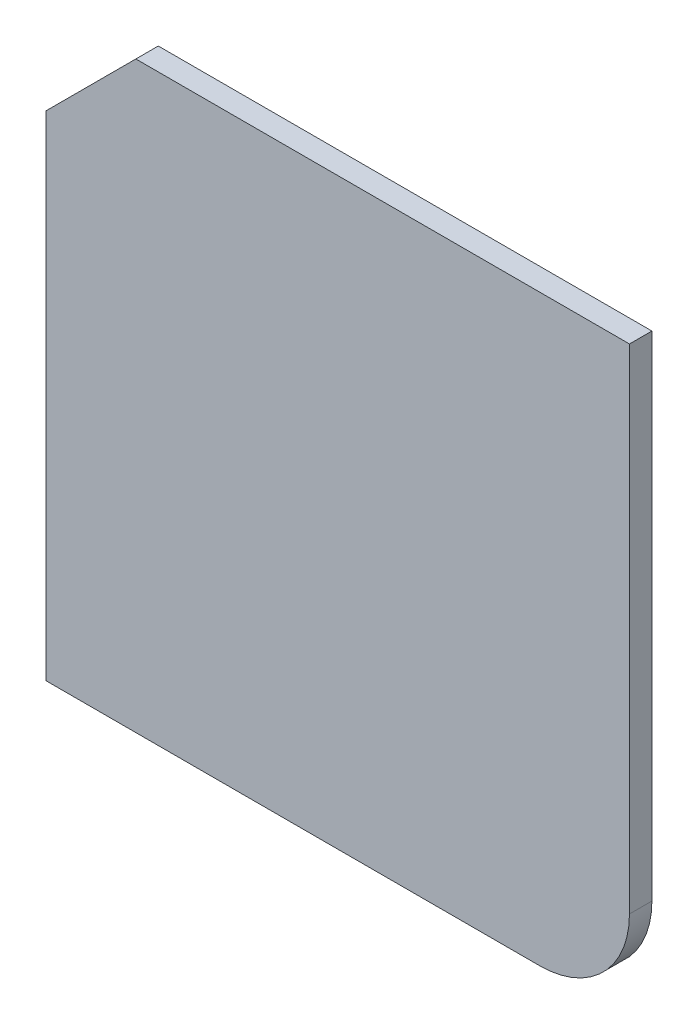
ISO-10303-21;
HEADER;
FILE_DESCRIPTION(('STEP AP214'),'2;1');
FILE_NAME('part.step','',(''),(''),'','','');
FILE_SCHEMA(('AUTOMOTIVE_DESIGN { 1 0 10303 214 1 1 1 1 }'));
ENDSEC;
DATA;
#1=APPLICATION_CONTEXT('core data for automotive mechanical design processes');
#2=APPLICATION_PROTOCOL_DEFINITION('international standard','automotive_design',2000,#1);
#3=PRODUCT_CONTEXT('',#1,'mechanical');
#4=PRODUCT('Part','Part','',(#3));
#5=PRODUCT_RELATED_PRODUCT_CATEGORY('part','',(#4));
#6=PRODUCT_DEFINITION_FORMATION('','',#4);
#7=PRODUCT_DEFINITION_CONTEXT('part definition',#1,'design');
#8=PRODUCT_DEFINITION('design','',#6,#7);
#9=PRODUCT_DEFINITION_SHAPE('','',#8);
#10=(LENGTH_UNIT() NAMED_UNIT(*) SI_UNIT(.MILLI.,.METRE.));
#11=(NAMED_UNIT(*) PLANE_ANGLE_UNIT() SI_UNIT($,.RADIAN.));
#12=(NAMED_UNIT(*) SI_UNIT($,.STERADIAN.) SOLID_ANGLE_UNIT());
#13=UNCERTAINTY_MEASURE_WITH_UNIT(LENGTH_MEASURE(1.E-05),#10,'distance_accuracy_value','');
#14=(GEOMETRIC_REPRESENTATION_CONTEXT(3) GLOBAL_UNCERTAINTY_ASSIGNED_CONTEXT((#13)) GLOBAL_UNIT_ASSIGNED_CONTEXT((#10,
#11,#12)) REPRESENTATION_CONTEXT('',''));
#15=CARTESIAN_POINT('',(0.,0.,0.));
#16=DIRECTION('',(0.,0.,1.));
#17=DIRECTION('',(1.,0.,0.));
#18=AXIS2_PLACEMENT_3D('',#15,#16,#17);
#19=CARTESIAN_POINT('',(0.,0.,5.));
#20=DIRECTION('',(1.,0.,0.));
#21=DIRECTION('',(0.,0.,-1.));
#22=AXIS2_PLACEMENT_3D('',#19,#20,#21);
#23=PLANE('',#22);
#24=DIRECTION('',(0.,-1.,0.));
#25=VECTOR('',#24,1.);
#26=CARTESIAN_POINT('',(0.,0.,5.));
#27=LINE('',#26,#25);
#28=CARTESIAN_POINT('',(0.,110.,5.));
#29=VERTEX_POINT('',#28);
#30=CARTESIAN_POINT('',(0.,0.,5.));
#31=VERTEX_POINT('',#30);
#32=EDGE_CURVE('E86',#29,#31,#27,.T.);
#33=ORIENTED_EDGE('',*,*,#32,.F.);
#34=DIRECTION('',(0.,0.,-1.));
#35=VECTOR('',#34,1.);
#36=CARTESIAN_POINT('',(0.,110.,5.));
#37=LINE('',#36,#35);
#38=CARTESIAN_POINT('',(0.,110.,0.));
#39=VERTEX_POINT('',#38);
#40=EDGE_CURVE('E124',#29,#39,#37,.T.);
#41=ORIENTED_EDGE('',*,*,#40,.T.);
#42=DIRECTION('',(0.,-1.,0.));
#43=VECTOR('',#42,1.);
#44=CARTESIAN_POINT('',(0.,0.,0.));
#45=LINE('',#44,#43);
#46=CARTESIAN_POINT('',(0.,0.,0.));
#47=VERTEX_POINT('',#46);
#48=EDGE_CURVE('E107',#39,#47,#45,.T.);
#49=ORIENTED_EDGE('',*,*,#48,.T.);
#50=DIRECTION('',(0.,0.,-1.));
#51=VECTOR('',#50,1.);
#52=CARTESIAN_POINT('',(0.,0.,5.));
#53=LINE('',#52,#51);
#54=EDGE_CURVE('E102',#31,#47,#53,.T.);
#55=ORIENTED_EDGE('',*,*,#54,.F.);
#56=EDGE_LOOP('',(#33,#41,#49,#55));
#57=FACE_BOUND('',#56,.T.);
#58=ADVANCED_FACE('F33',(#57),#23,.F.);
#59=CARTESIAN_POINT('',(0.,0.,5.));
#60=DIRECTION('',(0.,1.,0.));
#61=DIRECTION('',(0.,0.,1.));
#62=AXIS2_PLACEMENT_3D('',#59,#60,#61);
#63=PLANE('',#62);
#64=DIRECTION('',(1.,0.,0.));
#65=VECTOR('',#64,1.);
#66=CARTESIAN_POINT('',(0.,0.,0.));
#67=LINE('',#66,#65);
#68=CARTESIAN_POINT('',(110.,0.,0.));
#69=VERTEX_POINT('',#68);
#70=EDGE_CURVE('E128',#47,#69,#67,.T.);
#71=ORIENTED_EDGE('',*,*,#70,.T.);
#72=DIRECTION('',(0.,0.,-1.));
#73=VECTOR('',#72,1.);
#74=CARTESIAN_POINT('',(110.,0.,5.));
#75=LINE('',#74,#73);
#76=CARTESIAN_POINT('',(110.,0.,5.));
#77=VERTEX_POINT('',#76);
#78=EDGE_CURVE('E104',#69,#77,#75,.F.);
#79=ORIENTED_EDGE('',*,*,#78,.T.);
#80=DIRECTION('',(1.,0.,0.));
#81=VECTOR('',#80,1.);
#82=CARTESIAN_POINT('',(0.,0.,5.));
#83=LINE('',#82,#81);
#84=EDGE_CURVE('E89',#31,#77,#83,.T.);
#85=ORIENTED_EDGE('',*,*,#84,.F.);
#86=ORIENTED_EDGE('',*,*,#54,.T.);
#87=EDGE_LOOP('',(#71,#79,#85,#86));
#88=FACE_BOUND('',#87,.T.);
#89=ADVANCED_FACE('F101',(#88),#63,.F.);
#90=CARTESIAN_POINT('',(130.,0.,5.));
#91=DIRECTION('',(-1.,0.,0.));
#92=DIRECTION('',(0.,0.,1.));
#93=AXIS2_PLACEMENT_3D('',#90,#91,#92);
#94=PLANE('',#93);
#95=DIRECTION('',(0.,1.,0.));
#96=VECTOR('',#95,1.);
#97=CARTESIAN_POINT('',(130.,0.,5.));
#98=LINE('',#97,#96);
#99=CARTESIAN_POINT('',(130.,20.,5.));
#100=VERTEX_POINT('',#99);
#101=CARTESIAN_POINT('',(130.,130.,5.));
#102=VERTEX_POINT('',#101);
#103=EDGE_CURVE('E105',#100,#102,#98,.T.);
#104=ORIENTED_EDGE('',*,*,#103,.F.);
#105=DIRECTION('',(0.,0.,-1.));
#106=VECTOR('',#105,1.);
#107=CARTESIAN_POINT('',(130.,20.,5.));
#108=LINE('',#107,#106);
#109=CARTESIAN_POINT('',(130.,20.,0.));
#110=VERTEX_POINT('',#109);
#111=EDGE_CURVE('E109',#100,#110,#108,.T.);
#112=ORIENTED_EDGE('',*,*,#111,.T.);
#113=DIRECTION('',(0.,1.,0.));
#114=VECTOR('',#113,1.);
#115=CARTESIAN_POINT('',(130.,0.,0.));
#116=LINE('',#115,#114);
#117=CARTESIAN_POINT('',(130.,130.,0.));
#118=VERTEX_POINT('',#117);
#119=EDGE_CURVE('E130',#110,#118,#116,.T.);
#120=ORIENTED_EDGE('',*,*,#119,.T.);
#121=DIRECTION('',(0.,0.,-1.));
#122=VECTOR('',#121,1.);
#123=CARTESIAN_POINT('',(130.,130.,5.));
#124=LINE('',#123,#122);
#125=EDGE_CURVE('E110',#102,#118,#124,.T.);
#126=ORIENTED_EDGE('',*,*,#125,.F.);
#127=EDGE_LOOP('',(#104,#112,#120,#126));
#128=FACE_BOUND('',#127,.T.);
#129=ADVANCED_FACE('F149',(#128),#94,.F.);
#130=CARTESIAN_POINT('',(0.,130.,5.));
#131=DIRECTION('',(0.,-1.,0.));
#132=DIRECTION('',(0.,0.,-1.));
#133=AXIS2_PLACEMENT_3D('',#130,#131,#132);
#134=PLANE('',#133);
#135=DIRECTION('',(-1.,0.,0.));
#136=VECTOR('',#135,1.);
#137=CARTESIAN_POINT('',(0.,130.,0.));
#138=LINE('',#137,#136);
#139=CARTESIAN_POINT('',(20.0000000000001,130.,0.));
#140=VERTEX_POINT('',#139);
#141=EDGE_CURVE('E96',#118,#140,#138,.T.);
#142=ORIENTED_EDGE('',*,*,#141,.T.);
#143=DIRECTION('',(0.,0.,1.));
#144=VECTOR('',#143,1.);
#145=CARTESIAN_POINT('',(20.0000000000001,130.,5.));
#146=LINE('',#145,#144);
#147=CARTESIAN_POINT('',(20.0000000000001,130.,5.));
#148=VERTEX_POINT('',#147);
#149=EDGE_CURVE('E41',#140,#148,#146,.T.);
#150=ORIENTED_EDGE('',*,*,#149,.T.);
#151=DIRECTION('',(-1.,0.,0.));
#152=VECTOR('',#151,1.);
#153=CARTESIAN_POINT('',(0.,130.,5.));
#154=LINE('',#153,#152);
#155=EDGE_CURVE('E116',#102,#148,#154,.T.);
#156=ORIENTED_EDGE('',*,*,#155,.F.);
#157=ORIENTED_EDGE('',*,*,#125,.T.);
#158=EDGE_LOOP('',(#142,#150,#156,#157));
#159=FACE_BOUND('',#158,.T.);
#160=ADVANCED_FACE('F135',(#159),#134,.F.);
#161=CARTESIAN_POINT('',(0.,130.,5.));
#162=DIRECTION('',(0.,0.,-1.));
#163=DIRECTION('',(-1.,0.,0.));
#164=AXIS2_PLACEMENT_3D('',#161,#162,#163);
#165=PLANE('',#164);
#166=ORIENTED_EDGE('',*,*,#155,.T.);
#167=DIRECTION('',(0.707106781186549,0.707106781186546,0.));
#168=VECTOR('',#167,1.);
#169=CARTESIAN_POINT('',(0.,110.,5.));
#170=LINE('',#169,#168);
#171=EDGE_CURVE('E11',#148,#29,#170,.F.);
#172=ORIENTED_EDGE('',*,*,#171,.T.);
#173=ORIENTED_EDGE('',*,*,#32,.T.);
#174=ORIENTED_EDGE('',*,*,#84,.T.);
#175=CARTESIAN_POINT('',(110.,20.,5.));
#176=DIRECTION('',(0.,0.,-1.));
#177=DIRECTION('',(-1.,0.,0.));
#178=AXIS2_PLACEMENT_3D('',#175,#176,#177);
#179=CIRCLE('',#178,20.);
#180=EDGE_CURVE('E122',#77,#100,#179,.F.);
#181=ORIENTED_EDGE('',*,*,#180,.T.);
#182=ORIENTED_EDGE('',*,*,#103,.T.);
#183=EDGE_LOOP('',(#166,#172,#173,#174,#181,#182));
#184=FACE_BOUND('',#183,.T.);
#185=ADVANCED_FACE('F88',(#184),#165,.F.);
#186=CARTESIAN_POINT('',(0.,130.,0.));
#187=DIRECTION('',(0.,0.,-1.));
#188=DIRECTION('',(-1.,0.,0.));
#189=AXIS2_PLACEMENT_3D('',#186,#187,#188);
#190=PLANE('',#189);
#191=ORIENTED_EDGE('',*,*,#48,.F.);
#192=DIRECTION('',(-0.707106781186549,-0.707106781186546,0.));
#193=VECTOR('',#192,1.);
#194=CARTESIAN_POINT('',(9.99999999999999,120.,0.));
#195=LINE('',#194,#193);
#196=EDGE_CURVE('E55',#39,#140,#195,.F.);
#197=ORIENTED_EDGE('',*,*,#196,.T.);
#198=ORIENTED_EDGE('',*,*,#141,.F.);
#199=ORIENTED_EDGE('',*,*,#119,.F.);
#200=CARTESIAN_POINT('',(110.,20.,0.));
#201=DIRECTION('',(0.,0.,-1.));
#202=DIRECTION('',(-1.,0.,0.));
#203=AXIS2_PLACEMENT_3D('',#200,#201,#202);
#204=CIRCLE('',#203,20.);
#205=EDGE_CURVE('E113',#110,#69,#204,.T.);
#206=ORIENTED_EDGE('',*,*,#205,.T.);
#207=ORIENTED_EDGE('',*,*,#70,.F.);
#208=EDGE_LOOP('',(#191,#197,#198,#199,#206,#207));
#209=FACE_BOUND('',#208,.T.);
#210=ADVANCED_FACE('F127',(#209),#190,.T.);
#211=CARTESIAN_POINT('',(110.,20.,5.));
#212=DIRECTION('',(0.,0.,-1.));
#213=DIRECTION('',(-1.,0.,0.));
#214=AXIS2_PLACEMENT_3D('',#211,#212,#213);
#215=CYLINDRICAL_SURFACE('',#214,20.);
#216=ORIENTED_EDGE('',*,*,#180,.F.);
#217=ORIENTED_EDGE('',*,*,#78,.F.);
#218=ORIENTED_EDGE('',*,*,#205,.F.);
#219=ORIENTED_EDGE('',*,*,#111,.F.);
#220=EDGE_LOOP('',(#216,#217,#218,#219));
#221=FACE_BOUND('',#220,.T.);
#222=ADVANCED_FACE('F139',(#221),#215,.T.);
#223=CARTESIAN_POINT('',(0.,110.,5.));
#224=DIRECTION('',(0.707106781186546,-0.707106781186549,0.));
#225=DIRECTION('',(0.707106781186549,0.707106781186546,0.));
#226=AXIS2_PLACEMENT_3D('',#223,#224,#225);
#227=PLANE('',#226);
#228=ORIENTED_EDGE('',*,*,#171,.F.);
#229=ORIENTED_EDGE('',*,*,#149,.F.);
#230=ORIENTED_EDGE('',*,*,#196,.F.);
#231=ORIENTED_EDGE('',*,*,#40,.F.);
#232=EDGE_LOOP('',(#228,#229,#230,#231));
#233=FACE_BOUND('',#232,.T.);
#234=ADVANCED_FACE('F35',(#233),#227,.F.);
#235=CLOSED_SHELL('',(#58,#89,#129,#160,#185,#210,#222,#234));
#236=MANIFOLD_SOLID_BREP('B2',#235);
#237=ADVANCED_BREP_SHAPE_REPRESENTATION('',(#18,#236),#14);
#238=SHAPE_DEFINITION_REPRESENTATION(#9,#237);
ENDSEC;
END-ISO-10303-21;
